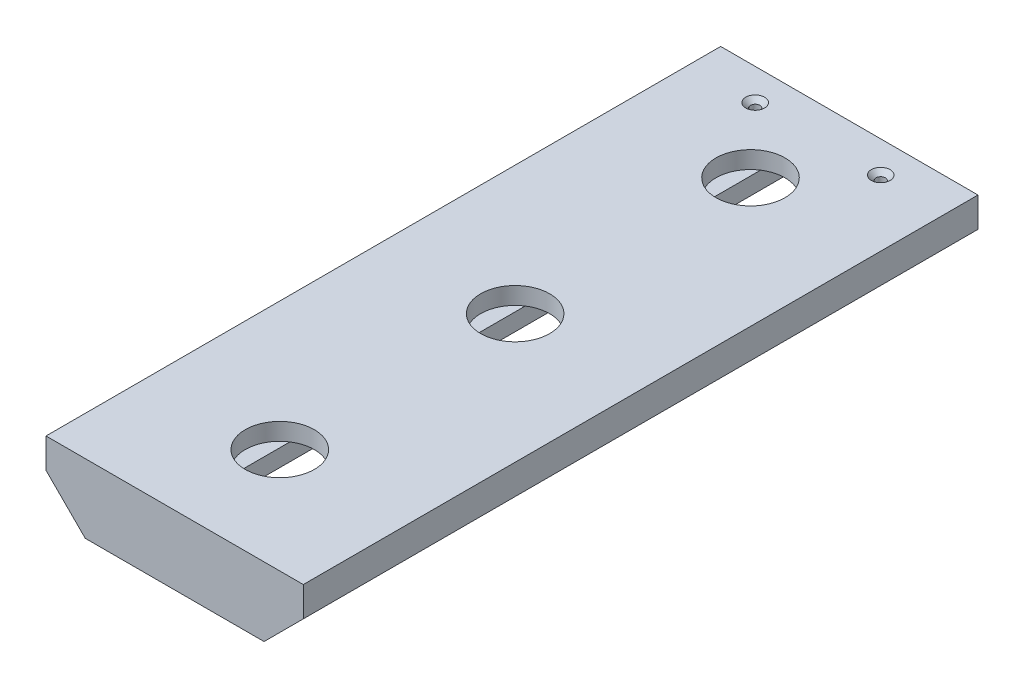
ISO-10303-21;
HEADER;
FILE_DESCRIPTION(('STEP AP214'),'2;1');
FILE_NAME('part.step','',(''),(''),'','','');
FILE_SCHEMA(('AUTOMOTIVE_DESIGN { 1 0 10303 214 1 1 1 1 }'));
ENDSEC;
DATA;
#1=APPLICATION_CONTEXT('core data for automotive mechanical design processes');
#2=APPLICATION_PROTOCOL_DEFINITION('international standard','automotive_design',2000,#1);
#3=PRODUCT_CONTEXT('',#1,'mechanical');
#4=PRODUCT('Part','Part','',(#3));
#5=PRODUCT_RELATED_PRODUCT_CATEGORY('part','',(#4));
#6=PRODUCT_DEFINITION_FORMATION('','',#4);
#7=PRODUCT_DEFINITION_CONTEXT('part definition',#1,'design');
#8=PRODUCT_DEFINITION('design','',#6,#7);
#9=PRODUCT_DEFINITION_SHAPE('','',#8);
#10=(LENGTH_UNIT() NAMED_UNIT(*) SI_UNIT(.MILLI.,.METRE.));
#11=(NAMED_UNIT(*) PLANE_ANGLE_UNIT() SI_UNIT($,.RADIAN.));
#12=(NAMED_UNIT(*) SI_UNIT($,.STERADIAN.) SOLID_ANGLE_UNIT());
#13=UNCERTAINTY_MEASURE_WITH_UNIT(LENGTH_MEASURE(1.E-05),#10,'distance_accuracy_value','');
#14=(GEOMETRIC_REPRESENTATION_CONTEXT(3) GLOBAL_UNCERTAINTY_ASSIGNED_CONTEXT((#13)) GLOBAL_UNIT_ASSIGNED_CONTEXT((#10,
#11,#12)) REPRESENTATION_CONTEXT('',''));
#15=CARTESIAN_POINT('',(0.,0.,0.));
#16=DIRECTION('',(0.,0.,1.));
#17=DIRECTION('',(1.,0.,0.));
#18=AXIS2_PLACEMENT_3D('',#15,#16,#17);
#19=CARTESIAN_POINT('',(14.2223313534778,14.2223313534778,213.));
#20=DIRECTION('',(0.707106781186548,0.707106781186548,0.));
#21=DIRECTION('',(-0.707106781186548,0.707106781186548,0.));
#22=AXIS2_PLACEMENT_3D('',#19,#20,#21);
#23=PLANE('',#22);
#24=DIRECTION('',(0.707106781186548,-0.707106781186548,0.));
#25=VECTOR('',#24,1.);
#26=CARTESIAN_POINT('',(14.2223313534778,14.2223313534778,0.));
#27=LINE('',#26,#25);
#28=CARTESIAN_POINT('',(4.7402310266037,23.7044316803519,0.));
#29=VERTEX_POINT('',#28);
#30=CARTESIAN_POINT('',(14.0331242454172,14.4115384615385,0.));
#31=VERTEX_POINT('',#30);
#32=EDGE_CURVE('E144',#29,#31,#27,.T.);
#33=ORIENTED_EDGE('',*,*,#32,.F.);
#34=DIRECTION('',(0.,0.,-1.));
#35=VECTOR('',#34,1.);
#36=CARTESIAN_POINT('',(4.7402310266037,23.7044316803519,213.));
#37=LINE('',#36,#35);
#38=CARTESIAN_POINT('',(4.7402310266037,23.7044316803519,213.));
#39=VERTEX_POINT('',#38);
#40=EDGE_CURVE('E358',#39,#29,#37,.T.);
#41=ORIENTED_EDGE('',*,*,#40,.F.);
#42=DIRECTION('',(0.707106781186548,-0.707106781186548,0.));
#43=VECTOR('',#42,1.);
#44=CARTESIAN_POINT('',(14.2223313534778,14.2223313534778,213.));
#45=LINE('',#44,#43);
#46=CARTESIAN_POINT('',(14.0331242454172,14.4115384615385,213.));
#47=VERTEX_POINT('',#46);
#48=EDGE_CURVE('E146',#39,#47,#45,.T.);
#49=ORIENTED_EDGE('',*,*,#48,.T.);
#50=DIRECTION('',(0.,0.,-1.));
#51=VECTOR('',#50,1.);
#52=CARTESIAN_POINT('',(14.0331242454172,14.4115384615385,213.));
#53=LINE('',#52,#51);
#54=EDGE_CURVE('E128',#47,#31,#53,.T.);
#55=ORIENTED_EDGE('',*,*,#54,.T.);
#56=EDGE_LOOP('',(#33,#41,#49,#55));
#57=FACE_BOUND('',#56,.T.);
#58=ADVANCED_FACE('F47',(#57),#23,.T.);
#59=CARTESIAN_POINT('',(4.7402310266037,0.,213.));
#60=DIRECTION('',(1.,0.,0.));
#61=DIRECTION('',(0.,0.,-1.));
#62=AXIS2_PLACEMENT_3D('',#59,#60,#61);
#63=PLANE('',#62);
#64=DIRECTION('',(0.,-1.,0.));
#65=VECTOR('',#64,1.);
#66=CARTESIAN_POINT('',(4.7402310266037,0.,0.));
#67=LINE('',#66,#65);
#68=CARTESIAN_POINT('',(4.7402310266037,25.4115384615385,0.));
#69=VERTEX_POINT('',#68);
#70=EDGE_CURVE('E175',#69,#29,#67,.T.);
#71=ORIENTED_EDGE('',*,*,#70,.F.);
#72=DIRECTION('',(0.,0.,-1.));
#73=VECTOR('',#72,1.);
#74=CARTESIAN_POINT('',(4.7402310266037,25.4115384615385,213.));
#75=LINE('',#74,#73);
#76=CARTESIAN_POINT('',(4.7402310266037,25.4115384615385,213.));
#77=VERTEX_POINT('',#76);
#78=EDGE_CURVE('E355',#77,#69,#75,.T.);
#79=ORIENTED_EDGE('',*,*,#78,.F.);
#80=DIRECTION('',(0.,-1.,0.));
#81=VECTOR('',#80,1.);
#82=CARTESIAN_POINT('',(4.7402310266037,0.,213.));
#83=LINE('',#82,#81);
#84=EDGE_CURVE('E151',#77,#39,#83,.T.);
#85=ORIENTED_EDGE('',*,*,#84,.T.);
#86=ORIENTED_EDGE('',*,*,#40,.T.);
#87=EDGE_LOOP('',(#71,#79,#85,#86));
#88=FACE_BOUND('',#87,.T.);
#89=ADVANCED_FACE('F387',(#88),#63,.T.);
#90=CARTESIAN_POINT('',(0.,25.4115384615385,213.));
#91=DIRECTION('',(0.,1.,0.));
#92=DIRECTION('',(0.,0.,1.));
#93=AXIS2_PLACEMENT_3D('',#90,#91,#92);
#94=PLANE('',#93);
#95=CARTESIAN_POINT('',(40.2402310266037,25.4115384615385,31.5));
#96=DIRECTION('',(0.,1.,0.));
#97=DIRECTION('',(0.,0.,1.));
#98=AXIS2_PLACEMENT_3D('',#95,#96,#97);
#99=CIRCLE('',#98,11.);
#100=CARTESIAN_POINT('',(40.2402310266037,25.4115384615385,42.5));
#101=VERTEX_POINT('',#100);
#102=EDGE_CURVE('E241',#101,#101,#99,.T.);
#103=ORIENTED_EDGE('',*,*,#102,.T.);
#104=EDGE_LOOP('',(#103));
#105=FACE_BOUND('',#104,.T.);
#106=CARTESIAN_POINT('',(40.2402310266037,25.4115384615385,106.5));
#107=DIRECTION('',(0.,1.,0.));
#108=DIRECTION('',(0.,0.,1.));
#109=AXIS2_PLACEMENT_3D('',#106,#107,#108);
#110=CIRCLE('',#109,11.);
#111=CARTESIAN_POINT('',(40.2402310266037,25.4115384615385,117.5));
#112=VERTEX_POINT('',#111);
#113=EDGE_CURVE('E245',#112,#112,#110,.T.);
#114=ORIENTED_EDGE('',*,*,#113,.T.);
#115=EDGE_LOOP('',(#114));
#116=FACE_BOUND('',#115,.T.);
#117=CARTESIAN_POINT('',(40.2402310266037,25.4115384615385,181.5));
#118=DIRECTION('',(0.,1.,0.));
#119=DIRECTION('',(0.,0.,1.));
#120=AXIS2_PLACEMENT_3D('',#117,#118,#119);
#121=CIRCLE('',#120,11.);
#122=CARTESIAN_POINT('',(40.2402310266037,25.4115384615385,192.5));
#123=VERTEX_POINT('',#122);
#124=EDGE_CURVE('E249',#123,#123,#121,.T.);
#125=ORIENTED_EDGE('',*,*,#124,.T.);
#126=EDGE_LOOP('',(#125));
#127=FACE_BOUND('',#126,.T.);
#128=CARTESIAN_POINT('',(60.2402310266037,25.4115384615385,10.));
#129=DIRECTION('',(0.,1.,0.));
#130=DIRECTION('',(0.,0.,1.));
#131=AXIS2_PLACEMENT_3D('',#128,#129,#130);
#132=CIRCLE('',#131,1.5);
#133=CARTESIAN_POINT('',(60.2402310266037,25.4115384615385,11.5));
#134=VERTEX_POINT('',#133);
#135=EDGE_CURVE('E211',#134,#134,#132,.T.);
#136=ORIENTED_EDGE('',*,*,#135,.T.);
#137=EDGE_LOOP('',(#136));
#138=FACE_BOUND('',#137,.T.);
#139=CARTESIAN_POINT('',(20.2402310266037,25.4115384615385,10.));
#140=DIRECTION('',(0.,1.,0.));
#141=DIRECTION('',(0.,0.,1.));
#142=AXIS2_PLACEMENT_3D('',#139,#140,#141);
#143=CIRCLE('',#142,1.5);
#144=CARTESIAN_POINT('',(20.2402310266037,25.4115384615385,11.5));
#145=VERTEX_POINT('',#144);
#146=EDGE_CURVE('E237',#145,#145,#143,.T.);
#147=ORIENTED_EDGE('',*,*,#146,.T.);
#148=EDGE_LOOP('',(#147));
#149=FACE_BOUND('',#148,.T.);
#150=DIRECTION('',(1.,0.,0.));
#151=VECTOR('',#150,1.);
#152=CARTESIAN_POINT('',(0.,25.4115384615385,0.));
#153=LINE('',#152,#151);
#154=CARTESIAN_POINT('',(75.7402310266037,25.4115384615385,0.));
#155=VERTEX_POINT('',#154);
#156=EDGE_CURVE('E170',#69,#155,#153,.T.);
#157=ORIENTED_EDGE('',*,*,#156,.T.);
#158=DIRECTION('',(0.,0.,-1.));
#159=VECTOR('',#158,1.);
#160=CARTESIAN_POINT('',(75.7402310266037,25.4115384615385,213.));
#161=LINE('',#160,#159);
#162=CARTESIAN_POINT('',(75.7402310266037,25.4115384615385,213.));
#163=VERTEX_POINT('',#162);
#164=EDGE_CURVE('E351',#163,#155,#161,.T.);
#165=ORIENTED_EDGE('',*,*,#164,.F.);
#166=DIRECTION('',(1.,0.,0.));
#167=VECTOR('',#166,1.);
#168=CARTESIAN_POINT('',(0.,25.4115384615385,213.));
#169=LINE('',#168,#167);
#170=EDGE_CURVE('E199',#77,#163,#169,.T.);
#171=ORIENTED_EDGE('',*,*,#170,.F.);
#172=ORIENTED_EDGE('',*,*,#78,.T.);
#173=EDGE_LOOP('',(#157,#165,#171,#172));
#174=FACE_BOUND('',#173,.T.);
#175=ADVANCED_FACE('F392',(#105,#116,#127,#138,#149,#174),#94,.F.);
#176=CARTESIAN_POINT('',(75.7402310266037,0.,213.));
#177=DIRECTION('',(1.,0.,0.));
#178=DIRECTION('',(0.,0.,-1.));
#179=AXIS2_PLACEMENT_3D('',#176,#177,#178);
#180=PLANE('',#179);
#181=DIRECTION('',(0.,-1.,0.));
#182=VECTOR('',#181,1.);
#183=CARTESIAN_POINT('',(75.7402310266037,0.,0.));
#184=LINE('',#183,#182);
#185=CARTESIAN_POINT('',(75.7402310266037,23.7044316803519,0.));
#186=VERTEX_POINT('',#185);
#187=EDGE_CURVE('E165',#155,#186,#184,.T.);
#188=ORIENTED_EDGE('',*,*,#187,.T.);
#189=DIRECTION('',(0.,0.,-1.));
#190=VECTOR('',#189,1.);
#191=CARTESIAN_POINT('',(75.7402310266037,23.7044316803519,213.));
#192=LINE('',#191,#190);
#193=CARTESIAN_POINT('',(75.7402310266037,23.7044316803519,213.));
#194=VERTEX_POINT('',#193);
#195=EDGE_CURVE('E348',#194,#186,#192,.T.);
#196=ORIENTED_EDGE('',*,*,#195,.F.);
#197=DIRECTION('',(0.,-1.,0.));
#198=VECTOR('',#197,1.);
#199=CARTESIAN_POINT('',(75.7402310266037,0.,213.));
#200=LINE('',#199,#198);
#201=EDGE_CURVE('E195',#163,#194,#200,.T.);
#202=ORIENTED_EDGE('',*,*,#201,.F.);
#203=ORIENTED_EDGE('',*,*,#164,.T.);
#204=EDGE_LOOP('',(#188,#196,#202,#203));
#205=FACE_BOUND('',#204,.T.);
#206=ADVANCED_FACE('F398',(#205),#180,.F.);
#207=CARTESIAN_POINT('',(26.0178996731259,-26.0178996731259,213.));
#208=DIRECTION('',(-0.707106781186548,0.707106781186548,0.));
#209=DIRECTION('',(-0.707106781186548,-0.707106781186548,0.));
#210=AXIS2_PLACEMENT_3D('',#207,#208,#209);
#211=PLANE('',#210);
#212=DIRECTION('',(0.707106781186548,0.707106781186548,0.));
#213=VECTOR('',#212,1.);
#214=CARTESIAN_POINT('',(26.0178996731259,-26.0178996731259,0.));
#215=LINE('',#214,#213);
#216=CARTESIAN_POINT('',(66.4473378077902,14.4115384615385,0.));
#217=VERTEX_POINT('',#216);
#218=EDGE_CURVE('E158',#217,#186,#215,.T.);
#219=ORIENTED_EDGE('',*,*,#218,.F.);
#220=DIRECTION('',(0.,0.,-1.));
#221=VECTOR('',#220,1.);
#222=CARTESIAN_POINT('',(66.4473378077902,14.4115384615385,213.));
#223=LINE('',#222,#221);
#224=CARTESIAN_POINT('',(66.4473378077902,14.4115384615385,213.));
#225=VERTEX_POINT('',#224);
#226=EDGE_CURVE('E345',#225,#217,#223,.T.);
#227=ORIENTED_EDGE('',*,*,#226,.F.);
#228=DIRECTION('',(0.707106781186548,0.707106781186548,0.));
#229=VECTOR('',#228,1.);
#230=CARTESIAN_POINT('',(26.0178996731259,-26.0178996731259,213.));
#231=LINE('',#230,#229);
#232=EDGE_CURVE('E191',#225,#194,#231,.T.);
#233=ORIENTED_EDGE('',*,*,#232,.T.);
#234=ORIENTED_EDGE('',*,*,#195,.T.);
#235=EDGE_LOOP('',(#219,#227,#233,#234));
#236=FACE_BOUND('',#235,.T.);
#237=ADVANCED_FACE('F402',(#236),#211,.T.);
#238=CARTESIAN_POINT('',(0.,14.4115384615385,213.));
#239=DIRECTION('',(0.,1.,0.));
#240=DIRECTION('',(0.,0.,1.));
#241=AXIS2_PLACEMENT_3D('',#238,#239,#240);
#242=PLANE('',#241);
#243=DIRECTION('',(1.,0.,0.));
#244=VECTOR('',#243,1.);
#245=CARTESIAN_POINT('',(0.,14.4115384615385,0.));
#246=LINE('',#245,#244);
#247=CARTESIAN_POINT('',(57.2402310266037,14.4115384615385,0.));
#248=VERTEX_POINT('',#247);
#249=EDGE_CURVE('E148',#248,#217,#246,.T.);
#250=ORIENTED_EDGE('',*,*,#249,.F.);
#251=DIRECTION('',(0.,0.,-1.));
#252=VECTOR('',#251,1.);
#253=CARTESIAN_POINT('',(57.2402310266037,14.4115384615385,213.));
#254=LINE('',#253,#252);
#255=CARTESIAN_POINT('',(57.2402310266037,14.4115384615385,213.));
#256=VERTEX_POINT('',#255);
#257=EDGE_CURVE('E342',#256,#248,#254,.T.);
#258=ORIENTED_EDGE('',*,*,#257,.F.);
#259=DIRECTION('',(1.,0.,0.));
#260=VECTOR('',#259,1.);
#261=CARTESIAN_POINT('',(0.,14.4115384615385,213.));
#262=LINE('',#261,#260);
#263=EDGE_CURVE('E187',#256,#225,#262,.T.);
#264=ORIENTED_EDGE('',*,*,#263,.T.);
#265=ORIENTED_EDGE('',*,*,#226,.T.);
#266=EDGE_LOOP('',(#250,#258,#264,#265));
#267=FACE_BOUND('',#266,.T.);
#268=ADVANCED_FACE('F406',(#267),#242,.T.);
#269=CARTESIAN_POINT('',(57.2402310266037,0.,213.));
#270=DIRECTION('',(1.,0.,0.));
#271=DIRECTION('',(0.,0.,-1.));
#272=AXIS2_PLACEMENT_3D('',#269,#270,#271);
#273=PLANE('',#272);
#274=DIRECTION('',(0.,-1.,0.));
#275=VECTOR('',#274,1.);
#276=CARTESIAN_POINT('',(57.2402310266037,0.,0.));
#277=LINE('',#276,#275);
#278=CARTESIAN_POINT('',(57.2402310266037,8.91153846153849,0.));
#279=VERTEX_POINT('',#278);
#280=EDGE_CURVE('E157',#248,#279,#277,.T.);
#281=ORIENTED_EDGE('',*,*,#280,.T.);
#282=DIRECTION('',(0.,0.,-1.));
#283=VECTOR('',#282,1.);
#284=CARTESIAN_POINT('',(57.2402310266037,8.91153846153849,213.));
#285=LINE('',#284,#283);
#286=CARTESIAN_POINT('',(57.2402310266037,8.91153846153849,213.));
#287=VERTEX_POINT('',#286);
#288=EDGE_CURVE('E338',#287,#279,#285,.T.);
#289=ORIENTED_EDGE('',*,*,#288,.F.);
#290=DIRECTION('',(0.,-1.,0.));
#291=VECTOR('',#290,1.);
#292=CARTESIAN_POINT('',(57.2402310266037,0.,213.));
#293=LINE('',#292,#291);
#294=EDGE_CURVE('E183',#256,#287,#293,.T.);
#295=ORIENTED_EDGE('',*,*,#294,.F.);
#296=ORIENTED_EDGE('',*,*,#257,.T.);
#297=EDGE_LOOP('',(#281,#289,#295,#296));
#298=FACE_BOUND('',#297,.T.);
#299=ADVANCED_FACE('F408',(#298),#273,.F.);
#300=CARTESIAN_POINT('',(29.906986969652,-29.9069869696519,213.));
#301=DIRECTION('',(-0.707106781186548,0.707106781186547,0.));
#302=DIRECTION('',(-0.707106781186547,-0.707106781186548,0.));
#303=AXIS2_PLACEMENT_3D('',#300,#301,#302);
#304=PLANE('',#303);
#305=DIRECTION('',(0.707106781186547,0.707106781186548,0.));
#306=VECTOR('',#305,1.);
#307=CARTESIAN_POINT('',(29.906986969652,-29.9069869696519,0.));
#308=LINE('',#307,#306);
#309=CARTESIAN_POINT('',(68.7255124008423,8.91153846153851,0.));
#310=VERTEX_POINT('',#309);
#311=CARTESIAN_POINT('',(81.2402310266037,21.4262570872999,0.));
#312=VERTEX_POINT('',#311);
#313=EDGE_CURVE('E307',#310,#312,#308,.T.);
#314=ORIENTED_EDGE('',*,*,#313,.T.);
#315=DIRECTION('',(0.,0.,-1.));
#316=VECTOR('',#315,1.);
#317=CARTESIAN_POINT('',(81.2402310266037,21.4262570872999,213.));
#318=LINE('',#317,#316);
#319=CARTESIAN_POINT('',(81.2402310266037,21.4262570872999,215.));
#320=VERTEX_POINT('',#319);
#321=EDGE_CURVE('E331',#320,#312,#318,.T.);
#322=ORIENTED_EDGE('',*,*,#321,.F.);
#323=DIRECTION('',(0.707106781186546,0.707106781186549,0.));
#324=VECTOR('',#323,1.);
#325=CARTESIAN_POINT('',(68.7255124008423,8.91153846153851,215.));
#326=LINE('',#325,#324);
#327=CARTESIAN_POINT('',(68.7255124008423,8.91153846153851,215.));
#328=VERTEX_POINT('',#327);
#329=EDGE_CURVE('E215',#328,#320,#326,.T.);
#330=ORIENTED_EDGE('',*,*,#329,.F.);
#331=DIRECTION('',(0.,0.,-1.));
#332=VECTOR('',#331,1.);
#333=CARTESIAN_POINT('',(68.7255124008423,8.91153846153851,213.));
#334=LINE('',#333,#332);
#335=EDGE_CURVE('E334',#328,#310,#334,.T.);
#336=ORIENTED_EDGE('',*,*,#335,.T.);
#337=EDGE_LOOP('',(#314,#322,#330,#336));
#338=FACE_BOUND('',#337,.T.);
#339=ADVANCED_FACE('F411',(#338),#304,.F.);
#340=CARTESIAN_POINT('',(81.2402310266037,0.,213.));
#341=DIRECTION('',(1.,0.,0.));
#342=DIRECTION('',(0.,0.,-1.));
#343=AXIS2_PLACEMENT_3D('',#340,#341,#342);
#344=PLANE('',#343);
#345=DIRECTION('',(0.,-1.,0.));
#346=VECTOR('',#345,1.);
#347=CARTESIAN_POINT('',(81.2402310266037,0.,0.));
#348=LINE('',#347,#346);
#349=CARTESIAN_POINT('',(81.2402310266037,30.9115384615385,0.));
#350=VERTEX_POINT('',#349);
#351=EDGE_CURVE('E301',#350,#312,#348,.T.);
#352=ORIENTED_EDGE('',*,*,#351,.F.);
#353=DIRECTION('',(0.,0.,-1.));
#354=VECTOR('',#353,1.);
#355=CARTESIAN_POINT('',(81.2402310266037,30.9115384615385,213.));
#356=LINE('',#355,#354);
#357=CARTESIAN_POINT('',(81.2402310266037,30.9115384615385,215.));
#358=VERTEX_POINT('',#357);
#359=EDGE_CURVE('E295',#358,#350,#356,.T.);
#360=ORIENTED_EDGE('',*,*,#359,.F.);
#361=DIRECTION('',(0.,1.,0.));
#362=VECTOR('',#361,1.);
#363=CARTESIAN_POINT('',(81.2402310266037,21.4262570872999,215.));
#364=LINE('',#363,#362);
#365=EDGE_CURVE('E180',#320,#358,#364,.T.);
#366=ORIENTED_EDGE('',*,*,#365,.F.);
#367=ORIENTED_EDGE('',*,*,#321,.T.);
#368=EDGE_LOOP('',(#352,#360,#366,#367));
#369=FACE_BOUND('',#368,.T.);
#370=ADVANCED_FACE('F273',(#369),#344,.T.);
#371=CARTESIAN_POINT('',(0.,30.9115384615385,213.));
#372=DIRECTION('',(0.,1.,0.));
#373=DIRECTION('',(-1.,0.,0.));
#374=AXIS2_PLACEMENT_3D('',#371,#372,#373);
#375=PLANE('',#374);
#376=CARTESIAN_POINT('',(40.2402310266037,30.9115384615385,31.5));
#377=DIRECTION('',(0.,1.,0.));
#378=DIRECTION('',(-1.,0.,0.));
#379=AXIS2_PLACEMENT_3D('',#376,#377,#378);
#380=CIRCLE('',#379,11.);
#381=CARTESIAN_POINT('',(29.2402310266037,30.9115384615385,31.5));
#382=VERTEX_POINT('',#381);
#383=EDGE_CURVE('E253',#382,#382,#380,.T.);
#384=ORIENTED_EDGE('',*,*,#383,.F.);
#385=EDGE_LOOP('',(#384));
#386=FACE_BOUND('',#385,.T.);
#387=CARTESIAN_POINT('',(40.2402310266037,30.9115384615385,106.5));
#388=DIRECTION('',(0.,1.,0.));
#389=DIRECTION('',(-1.,0.,0.));
#390=AXIS2_PLACEMENT_3D('',#387,#388,#389);
#391=CIRCLE('',#390,11.);
#392=CARTESIAN_POINT('',(29.2402310266037,30.9115384615385,106.5));
#393=VERTEX_POINT('',#392);
#394=EDGE_CURVE('E258',#393,#393,#391,.T.);
#395=ORIENTED_EDGE('',*,*,#394,.F.);
#396=EDGE_LOOP('',(#395));
#397=FACE_BOUND('',#396,.T.);
#398=CARTESIAN_POINT('',(40.2402310266037,30.9115384615385,181.5));
#399=DIRECTION('',(0.,1.,0.));
#400=DIRECTION('',(-1.,0.,0.));
#401=AXIS2_PLACEMENT_3D('',#398,#399,#400);
#402=CIRCLE('',#401,11.);
#403=CARTESIAN_POINT('',(29.2402310266037,30.9115384615385,181.5));
#404=VERTEX_POINT('',#403);
#405=EDGE_CURVE('E254',#404,#404,#402,.T.);
#406=ORIENTED_EDGE('',*,*,#405,.F.);
#407=EDGE_LOOP('',(#406));
#408=FACE_BOUND('',#407,.T.);
#409=CARTESIAN_POINT('',(60.2402310266037,30.9115384615385,10.));
#410=DIRECTION('',(0.,1.,0.));
#411=DIRECTION('',(-1.,0.,0.));
#412=AXIS2_PLACEMENT_3D('',#409,#410,#411);
#413=CIRCLE('',#412,3.00000000000006);
#414=CARTESIAN_POINT('',(60.2402310266037,30.9115384615385,13.0000000000001));
#415=VERTEX_POINT('',#414);
#416=EDGE_CURVE('E58',#415,#415,#413,.F.);
#417=ORIENTED_EDGE('',*,*,#416,.T.);
#418=EDGE_LOOP('',(#417));
#419=FACE_BOUND('',#418,.T.);
#420=CARTESIAN_POINT('',(20.2402310266037,30.9115384615385,10.));
#421=DIRECTION('',(0.,1.,0.));
#422=DIRECTION('',(-1.,0.,0.));
#423=AXIS2_PLACEMENT_3D('',#420,#421,#422);
#424=CIRCLE('',#423,2.99999999999998);
#425=CARTESIAN_POINT('',(17.2402310266037,30.9115384615385,10.));
#426=VERTEX_POINT('',#425);
#427=EDGE_CURVE('E285',#426,#426,#424,.F.);
#428=ORIENTED_EDGE('',*,*,#427,.T.);
#429=EDGE_LOOP('',(#428));
#430=FACE_BOUND('',#429,.T.);
#431=DIRECTION('',(1.,0.,0.));
#432=VECTOR('',#431,1.);
#433=CARTESIAN_POINT('',(0.,30.9115384615385,0.));
#434=LINE('',#433,#432);
#435=CARTESIAN_POINT('',(-0.759768973396298,30.9115384615385,0.));
#436=VERTEX_POINT('',#435);
#437=EDGE_CURVE('E289',#436,#350,#434,.T.);
#438=ORIENTED_EDGE('',*,*,#437,.F.);
#439=DIRECTION('',(0.,0.,-1.));
#440=VECTOR('',#439,1.);
#441=CARTESIAN_POINT('',(-0.759768973396298,30.9115384615385,213.));
#442=LINE('',#441,#440);
#443=CARTESIAN_POINT('',(-0.759768973396298,30.9115384615385,215.));
#444=VERTEX_POINT('',#443);
#445=EDGE_CURVE('E292',#444,#436,#442,.T.);
#446=ORIENTED_EDGE('',*,*,#445,.F.);
#447=DIRECTION('',(-1.,0.,0.));
#448=VECTOR('',#447,1.);
#449=CARTESIAN_POINT('',(81.2402310266037,30.9115384615385,215.));
#450=LINE('',#449,#448);
#451=EDGE_CURVE('E210',#358,#444,#450,.T.);
#452=ORIENTED_EDGE('',*,*,#451,.F.);
#453=ORIENTED_EDGE('',*,*,#359,.T.);
#454=EDGE_LOOP('',(#438,#446,#452,#453));
#455=FACE_BOUND('',#454,.T.);
#456=ADVANCED_FACE('F269',(#386,#397,#408,#419,#430,#455),#375,.T.);
#457=CARTESIAN_POINT('',(-0.759768973396293,0.,213.));
#458=DIRECTION('',(1.,0.,0.));
#459=DIRECTION('',(0.,1.,0.));
#460=AXIS2_PLACEMENT_3D('',#457,#458,#459);
#461=PLANE('',#460);
#462=DIRECTION('',(0.,-1.,0.));
#463=VECTOR('',#462,1.);
#464=CARTESIAN_POINT('',(-0.759768973396293,0.,0.));
#465=LINE('',#464,#463);
#466=CARTESIAN_POINT('',(-0.759768973396296,21.4262570872999,0.));
#467=VERTEX_POINT('',#466);
#468=EDGE_CURVE('E300',#436,#467,#465,.T.);
#469=ORIENTED_EDGE('',*,*,#468,.T.);
#470=DIRECTION('',(0.,0.,-1.));
#471=VECTOR('',#470,1.);
#472=CARTESIAN_POINT('',(-0.759768973396296,21.4262570872999,213.));
#473=LINE('',#472,#471);
#474=CARTESIAN_POINT('',(-0.759768973396296,21.4262570872999,215.));
#475=VERTEX_POINT('',#474);
#476=EDGE_CURVE('E323',#475,#467,#473,.T.);
#477=ORIENTED_EDGE('',*,*,#476,.F.);
#478=DIRECTION('',(0.,-1.,0.));
#479=VECTOR('',#478,1.);
#480=CARTESIAN_POINT('',(-0.759768973396298,30.9115384615385,215.));
#481=LINE('',#480,#479);
#482=EDGE_CURVE('E227',#444,#475,#481,.T.);
#483=ORIENTED_EDGE('',*,*,#482,.F.);
#484=ORIENTED_EDGE('',*,*,#445,.T.);
#485=EDGE_LOOP('',(#469,#477,#483,#484));
#486=FACE_BOUND('',#485,.T.);
#487=ADVANCED_FACE('F272',(#486),#461,.F.);
#488=CARTESIAN_POINT('',(10.3332440569518,10.3332440569518,213.));
#489=DIRECTION('',(0.707106781186547,0.707106781186548,0.));
#490=DIRECTION('',(-0.707106781186548,0.707106781186547,0.));
#491=AXIS2_PLACEMENT_3D('',#488,#489,#490);
#492=PLANE('',#491);
#493=DIRECTION('',(0.707106781186548,-0.707106781186547,0.));
#494=VECTOR('',#493,1.);
#495=CARTESIAN_POINT('',(10.3332440569518,10.3332440569518,0.));
#496=LINE('',#495,#494);
#497=CARTESIAN_POINT('',(11.7549496523651,8.91153846153848,0.));
#498=VERTEX_POINT('',#497);
#499=EDGE_CURVE('E305',#467,#498,#496,.T.);
#500=ORIENTED_EDGE('',*,*,#499,.T.);
#501=DIRECTION('',(0.,0.,-1.));
#502=VECTOR('',#501,1.);
#503=CARTESIAN_POINT('',(11.7549496523651,8.91153846153848,213.));
#504=LINE('',#503,#502);
#505=CARTESIAN_POINT('',(11.7549496523651,8.91153846153848,215.));
#506=VERTEX_POINT('',#505);
#507=EDGE_CURVE('E319',#506,#498,#504,.T.);
#508=ORIENTED_EDGE('',*,*,#507,.F.);
#509=DIRECTION('',(0.707106781186548,-0.707106781186547,0.));
#510=VECTOR('',#509,1.);
#511=CARTESIAN_POINT('',(-0.759768973396296,21.4262570872999,215.));
#512=LINE('',#511,#510);
#513=EDGE_CURVE('E223',#475,#506,#512,.T.);
#514=ORIENTED_EDGE('',*,*,#513,.F.);
#515=ORIENTED_EDGE('',*,*,#476,.T.);
#516=EDGE_LOOP('',(#500,#508,#514,#515));
#517=FACE_BOUND('',#516,.T.);
#518=ADVANCED_FACE('F421',(#517),#492,.F.);
#519=CARTESIAN_POINT('',(0.,8.91153846153848,213.));
#520=DIRECTION('',(0.,1.,0.));
#521=DIRECTION('',(-1.,0.,0.));
#522=AXIS2_PLACEMENT_3D('',#519,#520,#521);
#523=PLANE('',#522);
#524=DIRECTION('',(1.,0.,0.));
#525=VECTOR('',#524,1.);
#526=CARTESIAN_POINT('',(0.,8.91153846153848,0.));
#527=LINE('',#526,#525);
#528=CARTESIAN_POINT('',(23.2402310266037,8.91153846153849,0.));
#529=VERTEX_POINT('',#528);
#530=EDGE_CURVE('E138',#498,#529,#527,.T.);
#531=ORIENTED_EDGE('',*,*,#530,.T.);
#532=DIRECTION('',(0.,0.,-1.));
#533=VECTOR('',#532,1.);
#534=CARTESIAN_POINT('',(23.2402310266037,8.91153846153849,213.));
#535=LINE('',#534,#533);
#536=CARTESIAN_POINT('',(23.2402310266037,8.91153846153842,213.));
#537=VERTEX_POINT('',#536);
#538=EDGE_CURVE('E127',#537,#529,#535,.T.);
#539=ORIENTED_EDGE('',*,*,#538,.F.);
#540=DIRECTION('',(1.,0.,0.));
#541=VECTOR('',#540,1.);
#542=CARTESIAN_POINT('',(57.2402310266037,8.91153846153849,213.));
#543=LINE('',#542,#541);
#544=EDGE_CURVE('E206',#537,#287,#543,.T.);
#545=ORIENTED_EDGE('',*,*,#544,.T.);
#546=ORIENTED_EDGE('',*,*,#288,.T.);
#547=DIRECTION('',(1.,0.,0.));
#548=VECTOR('',#547,1.);
#549=CARTESIAN_POINT('',(0.,8.91153846153842,0.));
#550=LINE('',#549,#548);
#551=EDGE_CURVE('E164',#279,#310,#550,.T.);
#552=ORIENTED_EDGE('',*,*,#551,.T.);
#553=ORIENTED_EDGE('',*,*,#335,.F.);
#554=DIRECTION('',(1.,0.,0.));
#555=VECTOR('',#554,1.);
#556=CARTESIAN_POINT('',(11.7549496523651,8.91153846153848,215.));
#557=LINE('',#556,#555);
#558=EDGE_CURVE('E219',#506,#328,#557,.T.);
#559=ORIENTED_EDGE('',*,*,#558,.F.);
#560=ORIENTED_EDGE('',*,*,#507,.T.);
#561=EDGE_LOOP('',(#531,#539,#545,#546,#552,#553,#559,#560));
#562=FACE_BOUND('',#561,.T.);
#563=ADVANCED_FACE('F425',(#562),#523,.F.);
#564=CARTESIAN_POINT('',(23.2402310266037,0.,213.));
#565=DIRECTION('',(1.,0.,0.));
#566=DIRECTION('',(0.,0.,-1.));
#567=AXIS2_PLACEMENT_3D('',#564,#565,#566);
#568=PLANE('',#567);
#569=DIRECTION('',(0.,-1.,0.));
#570=VECTOR('',#569,1.);
#571=CARTESIAN_POINT('',(23.2402310266037,0.,0.));
#572=LINE('',#571,#570);
#573=CARTESIAN_POINT('',(23.2402310266037,14.4115384615385,0.));
#574=VERTEX_POINT('',#573);
#575=EDGE_CURVE('E131',#574,#529,#572,.T.);
#576=ORIENTED_EDGE('',*,*,#575,.F.);
#577=DIRECTION('',(0.,0.,-1.));
#578=VECTOR('',#577,1.);
#579=CARTESIAN_POINT('',(23.2402310266037,14.4115384615385,213.));
#580=LINE('',#579,#578);
#581=CARTESIAN_POINT('',(23.2402310266037,14.4115384615385,213.));
#582=VERTEX_POINT('',#581);
#583=EDGE_CURVE('E118',#582,#574,#580,.T.);
#584=ORIENTED_EDGE('',*,*,#583,.F.);
#585=DIRECTION('',(0.,-1.,0.));
#586=VECTOR('',#585,1.);
#587=CARTESIAN_POINT('',(23.2402310266037,0.,213.));
#588=LINE('',#587,#586);
#589=EDGE_CURVE('E65',#582,#537,#588,.T.);
#590=ORIENTED_EDGE('',*,*,#589,.T.);
#591=ORIENTED_EDGE('',*,*,#538,.T.);
#592=EDGE_LOOP('',(#576,#584,#590,#591));
#593=FACE_BOUND('',#592,.T.);
#594=ADVANCED_FACE('F132',(#593),#568,.T.);
#595=EDGE_CURVE('E123',#31,#574,#246,.T.);
#596=ORIENTED_EDGE('',*,*,#595,.F.);
#597=ORIENTED_EDGE('',*,*,#54,.F.);
#598=EDGE_CURVE('E124',#47,#582,#262,.T.);
#599=ORIENTED_EDGE('',*,*,#598,.T.);
#600=ORIENTED_EDGE('',*,*,#583,.T.);
#601=EDGE_LOOP('',(#596,#597,#599,#600));
#602=FACE_BOUND('',#601,.T.);
#603=ADVANCED_FACE('F120',(#602),#242,.T.);
#604=CARTESIAN_POINT('',(0.,0.,0.));
#605=DIRECTION('',(0.,0.,1.));
#606=DIRECTION('',(1.,0.,0.));
#607=AXIS2_PLACEMENT_3D('',#604,#605,#606);
#608=PLANE('',#607);
#609=ORIENTED_EDGE('',*,*,#32,.T.);
#610=ORIENTED_EDGE('',*,*,#595,.T.);
#611=ORIENTED_EDGE('',*,*,#575,.T.);
#612=ORIENTED_EDGE('',*,*,#530,.F.);
#613=ORIENTED_EDGE('',*,*,#499,.F.);
#614=ORIENTED_EDGE('',*,*,#468,.F.);
#615=ORIENTED_EDGE('',*,*,#437,.T.);
#616=ORIENTED_EDGE('',*,*,#351,.T.);
#617=ORIENTED_EDGE('',*,*,#313,.F.);
#618=ORIENTED_EDGE('',*,*,#551,.F.);
#619=ORIENTED_EDGE('',*,*,#280,.F.);
#620=ORIENTED_EDGE('',*,*,#249,.T.);
#621=ORIENTED_EDGE('',*,*,#218,.T.);
#622=ORIENTED_EDGE('',*,*,#187,.F.);
#623=ORIENTED_EDGE('',*,*,#156,.F.);
#624=ORIENTED_EDGE('',*,*,#70,.T.);
#625=EDGE_LOOP('',(#609,#610,#611,#612,#613,#614,#615,#616,#617,#618,#619,#620,#621,#622,#623,#624));
#626=FACE_BOUND('',#625,.T.);
#627=ADVANCED_FACE('F141',(#626),#608,.F.);
#628=CARTESIAN_POINT('',(0.,0.,213.));
#629=DIRECTION('',(0.,0.,1.));
#630=DIRECTION('',(1.,0.,0.));
#631=AXIS2_PLACEMENT_3D('',#628,#629,#630);
#632=PLANE('',#631);
#633=ORIENTED_EDGE('',*,*,#263,.F.);
#634=ORIENTED_EDGE('',*,*,#294,.T.);
#635=ORIENTED_EDGE('',*,*,#544,.F.);
#636=ORIENTED_EDGE('',*,*,#589,.F.);
#637=ORIENTED_EDGE('',*,*,#598,.F.);
#638=ORIENTED_EDGE('',*,*,#48,.F.);
#639=ORIENTED_EDGE('',*,*,#84,.F.);
#640=ORIENTED_EDGE('',*,*,#170,.T.);
#641=ORIENTED_EDGE('',*,*,#201,.T.);
#642=ORIENTED_EDGE('',*,*,#232,.F.);
#643=EDGE_LOOP('',(#633,#634,#635,#636,#637,#638,#639,#640,#641,#642));
#644=FACE_BOUND('',#643,.T.);
#645=ADVANCED_FACE('F436',(#644),#632,.F.);
#646=CARTESIAN_POINT('',(0.,0.,215.));
#647=DIRECTION('',(0.,0.,1.));
#648=DIRECTION('',(1.,0.,0.));
#649=AXIS2_PLACEMENT_3D('',#646,#647,#648);
#650=PLANE('',#649);
#651=ORIENTED_EDGE('',*,*,#451,.T.);
#652=ORIENTED_EDGE('',*,*,#482,.T.);
#653=ORIENTED_EDGE('',*,*,#513,.T.);
#654=ORIENTED_EDGE('',*,*,#558,.T.);
#655=ORIENTED_EDGE('',*,*,#329,.T.);
#656=ORIENTED_EDGE('',*,*,#365,.T.);
#657=EDGE_LOOP('',(#651,#652,#653,#654,#655,#656));
#658=FACE_BOUND('',#657,.T.);
#659=ADVANCED_FACE('F439',(#658),#650,.T.);
#660=CARTESIAN_POINT('',(20.2402310266037,20.9115384615385,10.));
#661=DIRECTION('',(0.,1.,0.));
#662=DIRECTION('',(-1.,0.,0.));
#663=AXIS2_PLACEMENT_3D('',#660,#661,#662);
#664=CYLINDRICAL_SURFACE('',#663,1.5);
#665=CARTESIAN_POINT('',(20.2402310266037,29.4115384615385,10.));
#666=DIRECTION('',(0.,1.,0.));
#667=DIRECTION('',(0.,0.,1.));
#668=AXIS2_PLACEMENT_3D('',#665,#666,#667);
#669=CIRCLE('',#668,1.5);
#670=CARTESIAN_POINT('',(20.2402310266037,29.4115384615385,11.5));
#671=VERTEX_POINT('',#670);
#672=EDGE_CURVE('E11',#671,#671,#669,.T.);
#673=ORIENTED_EDGE('',*,*,#672,.T.);
#674=EDGE_LOOP('',(#673));
#675=FACE_BOUND('',#674,.T.);
#676=ORIENTED_EDGE('',*,*,#146,.F.);
#677=EDGE_LOOP('',(#676));
#678=FACE_BOUND('',#677,.T.);
#679=ADVANCED_FACE('F382',(#675,#678),#664,.F.);
#680=CARTESIAN_POINT('',(60.2402310266037,20.9115384615385,10.));
#681=DIRECTION('',(0.,1.,0.));
#682=DIRECTION('',(-1.,0.,0.));
#683=AXIS2_PLACEMENT_3D('',#680,#681,#682);
#684=CYLINDRICAL_SURFACE('',#683,1.5);
#685=CARTESIAN_POINT('',(60.2402310266037,29.4115384615385,10.));
#686=DIRECTION('',(0.,1.,0.));
#687=DIRECTION('',(0.,0.,1.));
#688=AXIS2_PLACEMENT_3D('',#685,#686,#687);
#689=CIRCLE('',#688,1.5);
#690=CARTESIAN_POINT('',(60.2402310266037,29.4115384615385,11.5));
#691=VERTEX_POINT('',#690);
#692=EDGE_CURVE('E361',#691,#691,#689,.T.);
#693=ORIENTED_EDGE('',*,*,#692,.T.);
#694=EDGE_LOOP('',(#693));
#695=FACE_BOUND('',#694,.T.);
#696=ORIENTED_EDGE('',*,*,#135,.F.);
#697=EDGE_LOOP('',(#696));
#698=FACE_BOUND('',#697,.T.);
#699=ADVANCED_FACE('F370',(#695,#698),#684,.F.);
#700=CARTESIAN_POINT('',(60.2402310266037,29.4115384615385,10.));
#701=DIRECTION('',(0.,1.,0.));
#702=DIRECTION('',(0.,0.,1.));
#703=AXIS2_PLACEMENT_3D('',#700,#701,#702);
#704=CONICAL_SURFACE('',#703,1.5,0.785398163397455);
#705=CARTESIAN_POINT('',(60.2402310266037,30.9115384615385,13.0000000000001));
#706=CARTESIAN_POINT('',(60.2402310266037,30.8959134615385,12.9843750000001));
#707=CARTESIAN_POINT('',(60.2402310266037,30.8802884615385,12.9687500000001));
#708=CARTESIAN_POINT('',(60.2402310266037,30.8490384615385,12.9375000000001));
#709=CARTESIAN_POINT('',(60.2402310266037,30.8334134615385,12.9218750000001));
#710=CARTESIAN_POINT('',(60.2402310266037,30.8021634615385,12.8906250000001));
#711=CARTESIAN_POINT('',(60.2402310266037,30.7865384615385,12.8750000000001));
#712=CARTESIAN_POINT('',(60.2402310266037,30.7552884615385,12.8437500000001));
#713=CARTESIAN_POINT('',(60.2402310266037,30.7396634615385,12.8281250000001));
#714=CARTESIAN_POINT('',(60.2402310266037,30.7084134615385,12.7968750000001));
#715=CARTESIAN_POINT('',(60.2402310266037,30.6927884615385,12.7812500000001));
#716=CARTESIAN_POINT('',(60.2402310266037,30.6615384615385,12.75));
#717=CARTESIAN_POINT('',(60.2402310266037,30.6459134615385,12.734375));
#718=CARTESIAN_POINT('',(60.2402310266037,30.6146634615385,12.703125));
#719=CARTESIAN_POINT('',(60.2402310266037,30.5990384615385,12.6875));
#720=CARTESIAN_POINT('',(60.2402310266037,30.5677884615385,12.65625));
#721=CARTESIAN_POINT('',(60.2402310266037,30.5521634615385,12.640625));
#722=CARTESIAN_POINT('',(60.2402310266037,30.5209134615385,12.609375));
#723=CARTESIAN_POINT('',(60.2402310266037,30.5052884615385,12.59375));
#724=CARTESIAN_POINT('',(60.2402310266037,30.4740384615385,12.5625));
#725=CARTESIAN_POINT('',(60.2402310266037,30.4584134615385,12.546875));
#726=CARTESIAN_POINT('',(60.2402310266037,30.4271634615385,12.515625));
#727=CARTESIAN_POINT('',(60.2402310266037,30.4115384615385,12.5));
#728=CARTESIAN_POINT('',(60.2402310266037,30.3802884615385,12.46875));
#729=CARTESIAN_POINT('',(60.2402310266037,30.3646634615385,12.453125));
#730=CARTESIAN_POINT('',(60.2402310266037,30.3334134615385,12.421875));
#731=CARTESIAN_POINT('',(60.2402310266037,30.3177884615385,12.40625));
#732=CARTESIAN_POINT('',(60.2402310266037,30.2865384615385,12.375));
#733=CARTESIAN_POINT('',(60.2402310266037,30.2709134615385,12.359375));
#734=CARTESIAN_POINT('',(60.2402310266037,30.2396634615385,12.328125));
#735=CARTESIAN_POINT('',(60.2402310266037,30.2240384615385,12.3125));
#736=CARTESIAN_POINT('',(60.2402310266037,30.1927884615385,12.28125));
#737=CARTESIAN_POINT('',(60.2402310266037,30.1771634615385,12.265625));
#738=CARTESIAN_POINT('',(60.2402310266037,30.1459134615385,12.234375));
#739=CARTESIAN_POINT('',(60.2402310266037,30.1302884615385,12.21875));
#740=CARTESIAN_POINT('',(60.2402310266037,30.0990384615385,12.1875));
#741=CARTESIAN_POINT('',(60.2402310266037,30.0834134615385,12.171875));
#742=CARTESIAN_POINT('',(60.2402310266037,30.0521634615385,12.140625));
#743=CARTESIAN_POINT('',(60.2402310266037,30.0365384615385,12.125));
#744=CARTESIAN_POINT('',(60.2402310266037,30.0052884615385,12.09375));
#745=CARTESIAN_POINT('',(60.2402310266037,29.9896634615385,12.078125));
#746=CARTESIAN_POINT('',(60.2402310266037,29.9584134615385,12.046875));
#747=CARTESIAN_POINT('',(60.2402310266037,29.9427884615385,12.03125));
#748=CARTESIAN_POINT('',(60.2402310266037,29.9115384615385,12.));
#749=CARTESIAN_POINT('',(60.2402310266037,29.8959134615385,11.984375));
#750=CARTESIAN_POINT('',(60.2402310266037,29.8646634615385,11.953125));
#751=CARTESIAN_POINT('',(60.2402310266037,29.8490384615385,11.9375));
#752=CARTESIAN_POINT('',(60.2402310266037,29.8177884615385,11.90625));
#753=CARTESIAN_POINT('',(60.2402310266037,29.8021634615385,11.890625));
#754=CARTESIAN_POINT('',(60.2402310266037,29.7709134615385,11.859375));
#755=CARTESIAN_POINT('',(60.2402310266037,29.7552884615385,11.84375));
#756=CARTESIAN_POINT('',(60.2402310266037,29.7240384615385,11.8125));
#757=CARTESIAN_POINT('',(60.2402310266037,29.7084134615385,11.796875));
#758=CARTESIAN_POINT('',(60.2402310266037,29.6771634615385,11.765625));
#759=CARTESIAN_POINT('',(60.2402310266037,29.6615384615385,11.75));
#760=CARTESIAN_POINT('',(60.2402310266037,29.6302884615385,11.71875));
#761=CARTESIAN_POINT('',(60.2402310266037,29.6146634615385,11.703125));
#762=CARTESIAN_POINT('',(60.2402310266037,29.5834134615385,11.671875));
#763=CARTESIAN_POINT('',(60.2402310266037,29.5677884615385,11.65625));
#764=CARTESIAN_POINT('',(60.2402310266037,29.5365384615385,11.625));
#765=CARTESIAN_POINT('',(60.2402310266037,29.5209134615385,11.609375));
#766=CARTESIAN_POINT('',(60.2402310266037,29.4896634615385,11.578125));
#767=CARTESIAN_POINT('',(60.2402310266037,29.4740384615385,11.5625));
#768=CARTESIAN_POINT('',(60.2402310266037,29.4427884615385,11.53125));
#769=CARTESIAN_POINT('',(60.2402310266037,29.4271634615385,11.515625));
#770=CARTESIAN_POINT('',(60.2402310266037,29.4115384615385,11.5));
#771=B_SPLINE_CURVE_WITH_KNOTS('',3,(#705,#706,#707,#708,#709,#710,#711,#712,#713,#714,#715,
#716,#717,#718,#719,#720,#721,#722,#723,#724,#725,#726,#727,#728,#729,#730,#731,#732,#733,#734,
#735,#736,#737,#738,#739,#740,#741,#742,#743,#744,#745,#746,#747,#748,#749,#750,#751,#752,#753,
#754,#755,#756,#757,#758,#759,#760,#761,#762,#763,#764,#765,#766,#767,#768,#769,#770),
.UNSPECIFIED.,.F.,.F.,(4,2,2,2,2,2,2,2,2,2,2,2,2,2,2,2,2,2,2,2,2,2,2,2,2,2,2,2,2,2,2,2,4),(0.,
0.0662912607362389,0.13258252147248,0.198873782208722,0.265165042944963,0.331456303681202,
0.397747564417443,0.464038825153685,0.530330085889926,0.596621346626167,0.662912607362406,
0.729203868098647,0.795495128834889,0.86178638957113,0.928077650307369,0.99436891104361,
1.06066017177985,1.12695143251609,1.19324269325233,1.25953395398857,1.32582521472481,
1.39211647546105,1.4584077361973,1.52469899693354,1.59099025766978,1.65728151840602,
1.72357277914226,1.7898640398785,1.85615530061474,1.92244656135098,1.98873782208722,
2.05502908282346,2.1213203435597),.UNSPECIFIED.);
#772=EDGE_CURVE('BSEAM373',#415,#691,#771,.T.);
#773=ORIENTED_EDGE('',*,*,#416,.F.);
#774=ORIENTED_EDGE('',*,*,#692,.F.);
#775=ORIENTED_EDGE('',*,*,#772,.T.);
#776=ORIENTED_EDGE('',*,*,#772,.F.);
#777=EDGE_LOOP('',(#773,#775,#774,#776));
#778=FACE_BOUND('',#777,.T.);
#779=ADVANCED_FACE('F373',(#778),#704,.F.);
#780=CARTESIAN_POINT('',(20.2402310266037,29.4115384615385,10.));
#781=DIRECTION('',(0.,1.,0.));
#782=DIRECTION('',(0.,0.,1.));
#783=AXIS2_PLACEMENT_3D('',#780,#781,#782);
#784=CONICAL_SURFACE('',#783,1.5,0.785398163397445);
#785=ORIENTED_EDGE('',*,*,#427,.F.);
#786=EDGE_LOOP('',(#785));
#787=FACE_BOUND('',#786,.T.);
#788=ORIENTED_EDGE('',*,*,#672,.F.);
#789=EDGE_LOOP('',(#788));
#790=FACE_BOUND('',#789,.T.);
#791=ADVANCED_FACE('F50',(#787,#790),#784,.F.);
#792=CARTESIAN_POINT('',(40.2402310266037,-21.0884615384615,181.5));
#793=DIRECTION('',(0.,1.,0.));
#794=DIRECTION('',(-1.,0.,0.));
#795=AXIS2_PLACEMENT_3D('',#792,#793,#794);
#796=CYLINDRICAL_SURFACE('',#795,11.);
#797=ORIENTED_EDGE('',*,*,#405,.T.);
#798=EDGE_LOOP('',(#797));
#799=FACE_BOUND('',#798,.T.);
#800=ORIENTED_EDGE('',*,*,#124,.F.);
#801=EDGE_LOOP('',(#800));
#802=FACE_BOUND('',#801,.T.);
#803=ADVANCED_FACE('F380',(#799,#802),#796,.F.);
#804=CARTESIAN_POINT('',(40.2402310266037,-21.0884615384615,106.5));
#805=DIRECTION('',(0.,1.,0.));
#806=DIRECTION('',(-1.,0.,0.));
#807=AXIS2_PLACEMENT_3D('',#804,#805,#806);
#808=CYLINDRICAL_SURFACE('',#807,11.);
#809=ORIENTED_EDGE('',*,*,#394,.T.);
#810=EDGE_LOOP('',(#809));
#811=FACE_BOUND('',#810,.T.);
#812=ORIENTED_EDGE('',*,*,#113,.F.);
#813=EDGE_LOOP('',(#812));
#814=FACE_BOUND('',#813,.T.);
#815=ADVANCED_FACE('F448',(#811,#814),#808,.F.);
#816=CARTESIAN_POINT('',(40.2402310266037,-21.0884615384615,31.5));
#817=DIRECTION('',(0.,1.,0.));
#818=DIRECTION('',(-1.,0.,0.));
#819=AXIS2_PLACEMENT_3D('',#816,#817,#818);
#820=CYLINDRICAL_SURFACE('',#819,11.);
#821=ORIENTED_EDGE('',*,*,#383,.T.);
#822=EDGE_LOOP('',(#821));
#823=FACE_BOUND('',#822,.T.);
#824=ORIENTED_EDGE('',*,*,#102,.F.);
#825=EDGE_LOOP('',(#824));
#826=FACE_BOUND('',#825,.T.);
#827=ADVANCED_FACE('F266',(#823,#826),#820,.F.);
#828=CLOSED_SHELL('',(#58,#89,#175,#206,#237,#268,#299,#339,#370,#456,#487,#518,#563,#594,#603,
#627,#645,#659,#679,#699,#779,#791,#803,#815,#827));
#829=MANIFOLD_SOLID_BREP('B2',#828);
#830=ADVANCED_BREP_SHAPE_REPRESENTATION('',(#18,#829),#14);
#831=SHAPE_DEFINITION_REPRESENTATION(#9,#830);
ENDSEC;
END-ISO-10303-21;
